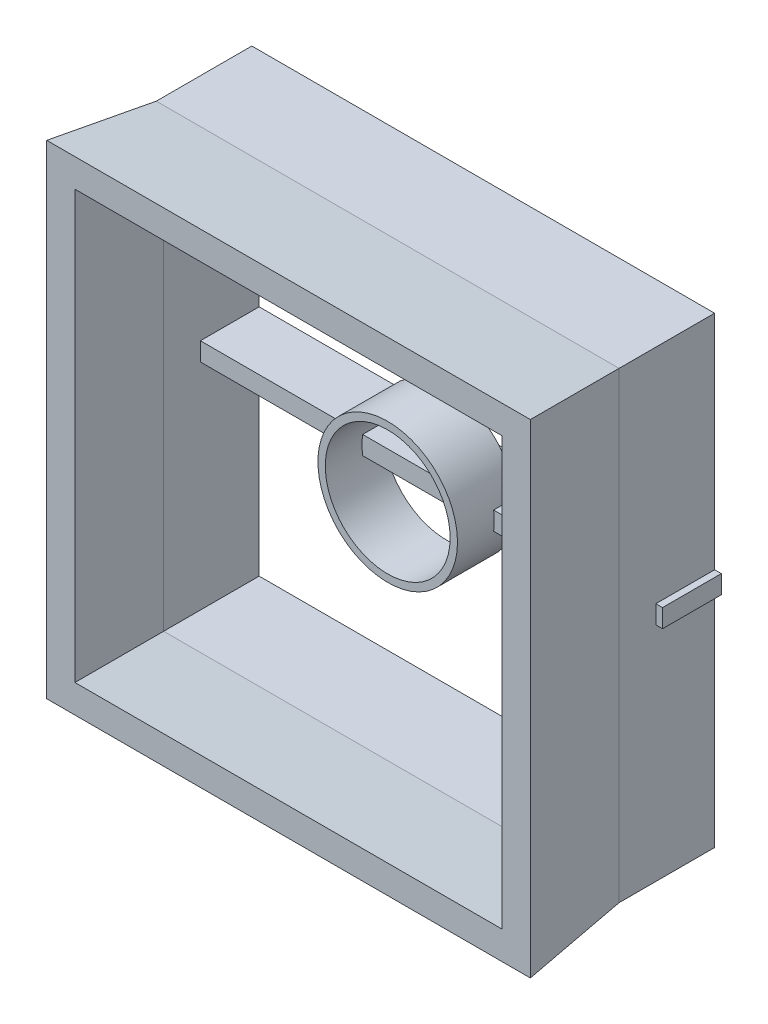
ISO-10303-21;
HEADER;
FILE_DESCRIPTION(('STEP AP214'),'2;1');
FILE_NAME('part.step','',(''),(''),'','','');
FILE_SCHEMA(('AUTOMOTIVE_DESIGN { 1 0 10303 214 1 1 1 1 }'));
ENDSEC;
DATA;
#1=APPLICATION_CONTEXT('core data for automotive mechanical design processes');
#2=APPLICATION_PROTOCOL_DEFINITION('international standard','automotive_design',2000,#1);
#3=PRODUCT_CONTEXT('',#1,'mechanical');
#4=PRODUCT('Part','Part','',(#3));
#5=PRODUCT_RELATED_PRODUCT_CATEGORY('part','',(#4));
#6=PRODUCT_DEFINITION_FORMATION('','',#4);
#7=PRODUCT_DEFINITION_CONTEXT('part definition',#1,'design');
#8=PRODUCT_DEFINITION('design','',#6,#7);
#9=PRODUCT_DEFINITION_SHAPE('','',#8);
#10=(LENGTH_UNIT() NAMED_UNIT(*) SI_UNIT(.MILLI.,.METRE.));
#11=(NAMED_UNIT(*) PLANE_ANGLE_UNIT() SI_UNIT($,.RADIAN.));
#12=(NAMED_UNIT(*) SI_UNIT($,.STERADIAN.) SOLID_ANGLE_UNIT());
#13=UNCERTAINTY_MEASURE_WITH_UNIT(LENGTH_MEASURE(1.E-05),#10,'distance_accuracy_value','');
#14=(GEOMETRIC_REPRESENTATION_CONTEXT(3) GLOBAL_UNCERTAINTY_ASSIGNED_CONTEXT((#13)) GLOBAL_UNIT_ASSIGNED_CONTEXT((#10,
#11,#12)) REPRESENTATION_CONTEXT('',''));
#15=CARTESIAN_POINT('',(0.,0.,0.));
#16=DIRECTION('',(0.,0.,1.));
#17=DIRECTION('',(1.,0.,0.));
#18=AXIS2_PLACEMENT_3D('',#15,#16,#17);
#19=CARTESIAN_POINT('',(0.,0.,-10.0000000000001));
#20=DIRECTION('',(0.,0.,1.));
#21=DIRECTION('',(1.,0.,0.));
#22=AXIS2_PLACEMENT_3D('',#19,#20,#21);
#23=PLANE('',#22);
#24=DIRECTION('',(-1.,0.,0.));
#25=VECTOR('',#24,1.);
#26=CARTESIAN_POINT('',(-64.1793889412606,2.5,-10.0000000000001));
#27=LINE('',#26,#25);
#28=CARTESIAN_POINT('',(-18.8348082018374,2.5,-10.0000000000001));
#29=VERTEX_POINT('',#28);
#30=CARTESIAN_POINT('',(-61.,2.5,-10.0000000000001));
#31=VERTEX_POINT('',#30);
#32=EDGE_CURVE('E373',#29,#31,#27,.T.);
#33=ORIENTED_EDGE('',*,*,#32,.T.);
#34=DIRECTION('',(0.,-1.,0.));
#35=VECTOR('',#34,1.);
#36=CARTESIAN_POINT('',(-61.,0.,-10.0000000000001));
#37=LINE('',#36,#35);
#38=CARTESIAN_POINT('',(-61.,-2.5,-10.0000000000001));
#39=VERTEX_POINT('',#38);
#40=EDGE_CURVE('E663',#31,#39,#37,.T.);
#41=ORIENTED_EDGE('',*,*,#40,.T.);
#42=DIRECTION('',(1.,0.,0.));
#43=VECTOR('',#42,1.);
#44=CARTESIAN_POINT('',(-64.1793889412606,-2.5,-10.0000000000001));
#45=LINE('',#44,#43);
#46=CARTESIAN_POINT('',(-18.8348082018374,-2.5,-10.0000000000001));
#47=VERTEX_POINT('',#46);
#48=EDGE_CURVE('E425',#39,#47,#45,.T.);
#49=ORIENTED_EDGE('',*,*,#48,.T.);
#50=CARTESIAN_POINT('',(0.,0.,-10.0000000000001));
#51=DIRECTION('',(0.,0.,1.));
#52=DIRECTION('',(1.,0.,0.));
#53=AXIS2_PLACEMENT_3D('',#50,#51,#52);
#54=CIRCLE('',#53,19.);
#55=EDGE_CURVE('E388',#47,#29,#54,.F.);
#56=ORIENTED_EDGE('',*,*,#55,.T.);
#57=EDGE_LOOP('',(#33,#41,#49,#56));
#58=FACE_BOUND('',#57,.T.);
#59=ADVANCED_FACE('F36',(#58),#23,.T.);
#60=CARTESIAN_POINT('',(64.8206110587394,2.5,-10.0000000000001));
#61=VERTEX_POINT('',#60);
#62=CARTESIAN_POINT('',(63.,2.5,-10.0000000000001));
#63=VERTEX_POINT('',#62);
#64=EDGE_CURVE('E358',#61,#63,#27,.T.);
#65=ORIENTED_EDGE('',*,*,#64,.T.);
#66=DIRECTION('',(0.,-1.,0.));
#67=VECTOR('',#66,1.);
#68=CARTESIAN_POINT('',(63.,0.,-10.0000000000001));
#69=LINE('',#68,#67);
#70=CARTESIAN_POINT('',(63.,-2.5,-10.0000000000001));
#71=VERTEX_POINT('',#70);
#72=EDGE_CURVE('E337',#63,#71,#69,.T.);
#73=ORIENTED_EDGE('',*,*,#72,.T.);
#74=CARTESIAN_POINT('',(64.8206110587394,-2.5,-10.0000000000001));
#75=VERTEX_POINT('',#74);
#76=EDGE_CURVE('E420',#71,#75,#45,.T.);
#77=ORIENTED_EDGE('',*,*,#76,.T.);
#78=DIRECTION('',(0.,1.,0.));
#79=VECTOR('',#78,1.);
#80=CARTESIAN_POINT('',(64.8206110587394,2.5,-10.0000000000001));
#81=LINE('',#80,#79);
#82=EDGE_CURVE('E345',#75,#61,#81,.T.);
#83=ORIENTED_EDGE('',*,*,#82,.T.);
#84=EDGE_LOOP('',(#65,#73,#77,#83));
#85=FACE_BOUND('',#84,.T.);
#86=ADVANCED_FACE('F558',(#85),#23,.T.);
#87=CARTESIAN_POINT('',(-64.1793889412606,2.5,-26.));
#88=DIRECTION('',(0.,1.,0.));
#89=DIRECTION('',(0.,0.,1.));
#90=AXIS2_PLACEMENT_3D('',#87,#88,#89);
#91=PLANE('',#90);
#92=DIRECTION('',(-1.,0.,0.));
#93=VECTOR('',#92,1.);
#94=CARTESIAN_POINT('',(-64.1793889412606,2.5,-26.));
#95=LINE('',#94,#93);
#96=CARTESIAN_POINT('',(64.8206110587394,2.5,-26.));
#97=VERTEX_POINT('',#96);
#98=CARTESIAN_POINT('',(63.,2.5,-26.));
#99=VERTEX_POINT('',#98);
#100=EDGE_CURVE('E62',#97,#99,#95,.T.);
#101=ORIENTED_EDGE('',*,*,#100,.T.);
#102=DIRECTION('',(0.,0.,1.));
#103=VECTOR('',#102,1.);
#104=CARTESIAN_POINT('',(63.,2.5,-26.));
#105=LINE('',#104,#103);
#106=EDGE_CURVE('E339',#99,#63,#105,.T.);
#107=ORIENTED_EDGE('',*,*,#106,.T.);
#108=ORIENTED_EDGE('',*,*,#64,.F.);
#109=DIRECTION('',(0.,0.,1.));
#110=VECTOR('',#109,1.);
#111=CARTESIAN_POINT('',(64.8206110587394,2.5,-26.));
#112=LINE('',#111,#110);
#113=EDGE_CURVE('E532',#97,#61,#112,.T.);
#114=ORIENTED_EDGE('',*,*,#113,.F.);
#115=EDGE_LOOP('',(#101,#107,#108,#114));
#116=FACE_BOUND('',#115,.T.);
#117=ADVANCED_FACE('F564',(#116),#91,.T.);
#118=DIRECTION('',(0.,0.,1.));
#119=VECTOR('',#118,1.);
#120=CARTESIAN_POINT('',(61.,2.5,-26.));
#121=LINE('',#120,#119);
#122=CARTESIAN_POINT('',(61.,2.5,-26.));
#123=VERTEX_POINT('',#122);
#124=CARTESIAN_POINT('',(61.,2.5,-10.0000000000001));
#125=VERTEX_POINT('',#124);
#126=EDGE_CURVE('E54',#123,#125,#121,.T.);
#127=ORIENTED_EDGE('',*,*,#126,.F.);
#128=CARTESIAN_POINT('',(-61.,2.49999999999999,-25.9999999999999));
#129=VERTEX_POINT('',#128);
#130=EDGE_CURVE('E255',#123,#129,#95,.T.);
#131=ORIENTED_EDGE('',*,*,#130,.T.);
#132=DIRECTION('',(0.,0.,1.));
#133=VECTOR('',#132,1.);
#134=CARTESIAN_POINT('',(-61.,2.5,-26.));
#135=LINE('',#134,#133);
#136=EDGE_CURVE('E291',#129,#31,#135,.T.);
#137=ORIENTED_EDGE('',*,*,#136,.T.);
#138=ORIENTED_EDGE('',*,*,#32,.F.);
#139=DIRECTION('',(0.,0.,1.));
#140=VECTOR('',#139,1.);
#141=CARTESIAN_POINT('',(-18.8348082018374,2.5,-16.));
#142=LINE('',#141,#140);
#143=CARTESIAN_POINT('',(-18.8348082018374,2.5,-16.));
#144=VERTEX_POINT('',#143);
#145=EDGE_CURVE('E384',#29,#144,#142,.F.);
#146=ORIENTED_EDGE('',*,*,#145,.T.);
#147=DIRECTION('',(-1.,0.,0.));
#148=VECTOR('',#147,1.);
#149=CARTESIAN_POINT('',(0.,2.5,-16.));
#150=LINE('',#149,#148);
#151=CARTESIAN_POINT('',(-16.8151717208002,2.5,-16.));
#152=VERTEX_POINT('',#151);
#153=EDGE_CURVE('E381',#152,#144,#150,.T.);
#154=ORIENTED_EDGE('',*,*,#153,.F.);
#155=DIRECTION('',(0.,0.,1.));
#156=VECTOR('',#155,1.);
#157=CARTESIAN_POINT('',(-16.8151717208002,2.5,-16.));
#158=LINE('',#157,#156);
#159=CARTESIAN_POINT('',(-16.8151717208002,2.5,-10.0000000000001));
#160=VERTEX_POINT('',#159);
#161=EDGE_CURVE('E409',#160,#152,#158,.F.);
#162=ORIENTED_EDGE('',*,*,#161,.F.);
#163=CARTESIAN_POINT('',(16.8151717208002,2.5,-10.0000000000001));
#164=VERTEX_POINT('',#163);
#165=EDGE_CURVE('E359',#164,#160,#27,.T.);
#166=ORIENTED_EDGE('',*,*,#165,.F.);
#167=DIRECTION('',(0.,0.,1.));
#168=VECTOR('',#167,1.);
#169=CARTESIAN_POINT('',(16.8151717208002,2.5,-16.));
#170=LINE('',#169,#168);
#171=CARTESIAN_POINT('',(16.8151717208002,2.5,-16.));
#172=VERTEX_POINT('',#171);
#173=EDGE_CURVE('E416',#172,#164,#170,.T.);
#174=ORIENTED_EDGE('',*,*,#173,.F.);
#175=CARTESIAN_POINT('',(18.8348082018374,2.5,-16.));
#176=VERTEX_POINT('',#175);
#177=EDGE_CURVE('E376',#176,#172,#150,.T.);
#178=ORIENTED_EDGE('',*,*,#177,.F.);
#179=DIRECTION('',(0.,0.,1.));
#180=VECTOR('',#179,1.);
#181=CARTESIAN_POINT('',(18.8348082018374,2.5,-16.));
#182=LINE('',#181,#180);
#183=CARTESIAN_POINT('',(18.8348082018374,2.5,-10.0000000000001));
#184=VERTEX_POINT('',#183);
#185=EDGE_CURVE('E379',#176,#184,#182,.T.);
#186=ORIENTED_EDGE('',*,*,#185,.T.);
#187=EDGE_CURVE('E355',#125,#184,#27,.T.);
#188=ORIENTED_EDGE('',*,*,#187,.F.);
#189=EDGE_LOOP('',(#127,#131,#137,#138,#146,#154,#162,#166,#174,#178,#186,#188));
#190=FACE_BOUND('',#189,.T.);
#191=ADVANCED_FACE('F566',(#190),#91,.T.);
#192=CARTESIAN_POINT('',(-64.1793889412606,-2.5,-26.));
#193=DIRECTION('',(0.,-1.,0.));
#194=DIRECTION('',(0.,0.,-1.));
#195=AXIS2_PLACEMENT_3D('',#192,#193,#194);
#196=PLANE('',#195);
#197=ORIENTED_EDGE('',*,*,#76,.F.);
#198=DIRECTION('',(0.,0.,-1.));
#199=VECTOR('',#198,1.);
#200=CARTESIAN_POINT('',(63.,-2.5,-26.));
#201=LINE('',#200,#199);
#202=CARTESIAN_POINT('',(63.,-2.5,-26.));
#203=VERTEX_POINT('',#202);
#204=EDGE_CURVE('E12',#71,#203,#201,.T.);
#205=ORIENTED_EDGE('',*,*,#204,.T.);
#206=DIRECTION('',(1.,0.,0.));
#207=VECTOR('',#206,1.);
#208=CARTESIAN_POINT('',(-64.1793889412606,-2.5,-26.));
#209=LINE('',#208,#207);
#210=CARTESIAN_POINT('',(64.8206110587394,-2.5,-26.));
#211=VERTEX_POINT('',#210);
#212=EDGE_CURVE('E488',#203,#211,#209,.T.);
#213=ORIENTED_EDGE('',*,*,#212,.T.);
#214=DIRECTION('',(0.,0.,1.));
#215=VECTOR('',#214,1.);
#216=CARTESIAN_POINT('',(64.8206110587394,-2.5,-26.));
#217=LINE('',#216,#215);
#218=EDGE_CURVE('E431',#211,#75,#217,.T.);
#219=ORIENTED_EDGE('',*,*,#218,.T.);
#220=EDGE_LOOP('',(#197,#205,#213,#219));
#221=FACE_BOUND('',#220,.T.);
#222=ADVANCED_FACE('F553',(#221),#196,.T.);
#223=DIRECTION('',(0.,0.,-1.));
#224=VECTOR('',#223,1.);
#225=CARTESIAN_POINT('',(61.,-2.5,-26.));
#226=LINE('',#225,#224);
#227=CARTESIAN_POINT('',(61.,-2.5,-10.0000000000001));
#228=VERTEX_POINT('',#227);
#229=CARTESIAN_POINT('',(61.,-2.5,-25.9999999999999));
#230=VERTEX_POINT('',#229);
#231=EDGE_CURVE('E507',#228,#230,#226,.T.);
#232=ORIENTED_EDGE('',*,*,#231,.F.);
#233=CARTESIAN_POINT('',(18.8348082018374,-2.5,-10.0000000000001));
#234=VERTEX_POINT('',#233);
#235=EDGE_CURVE('E423',#234,#228,#45,.T.);
#236=ORIENTED_EDGE('',*,*,#235,.F.);
#237=DIRECTION('',(0.,0.,1.));
#238=VECTOR('',#237,1.);
#239=CARTESIAN_POINT('',(18.8348082018374,-2.5,-16.));
#240=LINE('',#239,#238);
#241=CARTESIAN_POINT('',(18.8348082018374,-2.5,-16.));
#242=VERTEX_POINT('',#241);
#243=EDGE_CURVE('E380',#234,#242,#240,.F.);
#244=ORIENTED_EDGE('',*,*,#243,.T.);
#245=DIRECTION('',(1.,0.,0.));
#246=VECTOR('',#245,1.);
#247=CARTESIAN_POINT('',(0.,-2.5,-16.));
#248=LINE('',#247,#246);
#249=CARTESIAN_POINT('',(16.8151717208002,-2.5,-16.));
#250=VERTEX_POINT('',#249);
#251=EDGE_CURVE('E447',#250,#242,#248,.T.);
#252=ORIENTED_EDGE('',*,*,#251,.F.);
#253=DIRECTION('',(0.,0.,1.));
#254=VECTOR('',#253,1.);
#255=CARTESIAN_POINT('',(16.8151717208002,-2.5,-16.));
#256=LINE('',#255,#254);
#257=CARTESIAN_POINT('',(16.8151717208002,-2.5,-10.0000000000001));
#258=VERTEX_POINT('',#257);
#259=EDGE_CURVE('E413',#258,#250,#256,.F.);
#260=ORIENTED_EDGE('',*,*,#259,.F.);
#261=CARTESIAN_POINT('',(-16.8151717208002,-2.5,-10.0000000000001));
#262=VERTEX_POINT('',#261);
#263=EDGE_CURVE('E438',#262,#258,#45,.T.);
#264=ORIENTED_EDGE('',*,*,#263,.F.);
#265=DIRECTION('',(0.,0.,1.));
#266=VECTOR('',#265,1.);
#267=CARTESIAN_POINT('',(-16.8151717208002,-2.5,-16.));
#268=LINE('',#267,#266);
#269=CARTESIAN_POINT('',(-16.8151717208002,-2.5,-16.));
#270=VERTEX_POINT('',#269);
#271=EDGE_CURVE('E400',#270,#262,#268,.T.);
#272=ORIENTED_EDGE('',*,*,#271,.F.);
#273=CARTESIAN_POINT('',(-18.8348082018374,-2.5,-16.));
#274=VERTEX_POINT('',#273);
#275=EDGE_CURVE('E443',#274,#270,#248,.T.);
#276=ORIENTED_EDGE('',*,*,#275,.F.);
#277=DIRECTION('',(0.,0.,1.));
#278=VECTOR('',#277,1.);
#279=CARTESIAN_POINT('',(-18.8348082018374,-2.5,-16.));
#280=LINE('',#279,#278);
#281=EDGE_CURVE('E446',#274,#47,#280,.T.);
#282=ORIENTED_EDGE('',*,*,#281,.T.);
#283=ORIENTED_EDGE('',*,*,#48,.F.);
#284=DIRECTION('',(0.,0.,-1.));
#285=VECTOR('',#284,1.);
#286=CARTESIAN_POINT('',(-61.,-2.5,-26.));
#287=LINE('',#286,#285);
#288=CARTESIAN_POINT('',(-61.,-2.5,-26.));
#289=VERTEX_POINT('',#288);
#290=EDGE_CURVE('E419',#39,#289,#287,.T.);
#291=ORIENTED_EDGE('',*,*,#290,.T.);
#292=EDGE_CURVE('E494',#289,#230,#209,.T.);
#293=ORIENTED_EDGE('',*,*,#292,.T.);
#294=EDGE_LOOP('',(#232,#236,#244,#252,#260,#264,#272,#276,#282,#283,#291,#293));
#295=FACE_BOUND('',#294,.T.);
#296=ADVANCED_FACE('F467',(#295),#196,.T.);
#297=CARTESIAN_POINT('',(0.,0.,-16.));
#298=DIRECTION('',(0.,0.,1.));
#299=DIRECTION('',(1.,0.,0.));
#300=AXIS2_PLACEMENT_3D('',#297,#298,#299);
#301=PLANE('',#300);
#302=CARTESIAN_POINT('',(0.,0.,-16.));
#303=DIRECTION('',(0.,0.,1.));
#304=DIRECTION('',(1.,0.,0.));
#305=AXIS2_PLACEMENT_3D('',#302,#303,#304);
#306=CIRCLE('',#305,19.);
#307=EDGE_CURVE('E397',#176,#144,#306,.T.);
#308=ORIENTED_EDGE('',*,*,#307,.F.);
#309=ORIENTED_EDGE('',*,*,#177,.T.);
#310=CARTESIAN_POINT('',(0.,0.,-16.));
#311=DIRECTION('',(0.,0.,1.));
#312=DIRECTION('',(1.,0.,0.));
#313=AXIS2_PLACEMENT_3D('',#310,#311,#312);
#314=CIRCLE('',#313,17.);
#315=EDGE_CURVE('E389',#172,#152,#314,.T.);
#316=ORIENTED_EDGE('',*,*,#315,.T.);
#317=ORIENTED_EDGE('',*,*,#153,.T.);
#318=EDGE_LOOP('',(#308,#309,#316,#317));
#319=FACE_BOUND('',#318,.T.);
#320=ADVANCED_FACE('F850',(#319),#301,.F.);
#321=CARTESIAN_POINT('',(0.,0.,-16.));
#322=DIRECTION('',(0.,0.,1.));
#323=DIRECTION('',(1.,0.,0.));
#324=AXIS2_PLACEMENT_3D('',#321,#322,#323);
#325=CYLINDRICAL_SURFACE('',#324,19.);
#326=ORIENTED_EDGE('',*,*,#185,.F.);
#327=ORIENTED_EDGE('',*,*,#307,.T.);
#328=ORIENTED_EDGE('',*,*,#145,.F.);
#329=ORIENTED_EDGE('',*,*,#55,.F.);
#330=ORIENTED_EDGE('',*,*,#281,.F.);
#331=EDGE_CURVE('E401',#274,#242,#306,.T.);
#332=ORIENTED_EDGE('',*,*,#331,.T.);
#333=ORIENTED_EDGE('',*,*,#243,.F.);
#334=EDGE_CURVE('E386',#184,#234,#54,.F.);
#335=ORIENTED_EDGE('',*,*,#334,.F.);
#336=EDGE_LOOP('',(#326,#327,#328,#329,#330,#332,#333,#335));
#337=FACE_BOUND('',#336,.T.);
#338=CARTESIAN_POINT('',(0.,0.,0.));
#339=DIRECTION('',(0.,0.,1.));
#340=DIRECTION('',(1.,0.,0.));
#341=AXIS2_PLACEMENT_3D('',#338,#339,#340);
#342=CIRCLE('',#341,19.);
#343=CARTESIAN_POINT('',(19.,0.,0.));
#344=VERTEX_POINT('',#343);
#345=EDGE_CURVE('E392',#344,#344,#342,.T.);
#346=ORIENTED_EDGE('',*,*,#345,.F.);
#347=EDGE_LOOP('',(#346));
#348=FACE_BOUND('',#347,.T.);
#349=ADVANCED_FACE('F38',(#337,#348),#325,.T.);
#350=ORIENTED_EDGE('',*,*,#331,.F.);
#351=ORIENTED_EDGE('',*,*,#275,.T.);
#352=EDGE_CURVE('E393',#270,#250,#314,.T.);
#353=ORIENTED_EDGE('',*,*,#352,.T.);
#354=ORIENTED_EDGE('',*,*,#251,.T.);
#355=EDGE_LOOP('',(#350,#351,#353,#354));
#356=FACE_BOUND('',#355,.T.);
#357=ADVANCED_FACE('F457',(#356),#301,.F.);
#358=CARTESIAN_POINT('',(0.,0.,0.));
#359=DIRECTION('',(0.,0.,1.));
#360=DIRECTION('',(1.,0.,0.));
#361=AXIS2_PLACEMENT_3D('',#358,#359,#360);
#362=PLANE('',#361);
#363=CARTESIAN_POINT('',(0.,0.,0.));
#364=DIRECTION('',(0.,0.,1.));
#365=DIRECTION('',(1.,0.,0.));
#366=AXIS2_PLACEMENT_3D('',#363,#364,#365);
#367=CIRCLE('',#366,17.);
#368=CARTESIAN_POINT('',(17.,0.,0.));
#369=VERTEX_POINT('',#368);
#370=EDGE_CURVE('E394',#369,#369,#367,.T.);
#371=ORIENTED_EDGE('',*,*,#370,.F.);
#372=EDGE_LOOP('',(#371));
#373=FACE_BOUND('',#372,.T.);
#374=ORIENTED_EDGE('',*,*,#345,.T.);
#375=EDGE_LOOP('',(#374));
#376=FACE_BOUND('',#375,.T.);
#377=ADVANCED_FACE('F977',(#373,#376),#362,.T.);
#378=CARTESIAN_POINT('',(0.,0.,-16.));
#379=DIRECTION('',(0.,0.,1.));
#380=DIRECTION('',(1.,0.,0.));
#381=AXIS2_PLACEMENT_3D('',#378,#379,#380);
#382=CYLINDRICAL_SURFACE('',#381,17.);
#383=ORIENTED_EDGE('',*,*,#315,.F.);
#384=ORIENTED_EDGE('',*,*,#173,.T.);
#385=CARTESIAN_POINT('',(0.,0.,-10.0000000000001));
#386=DIRECTION('',(0.,0.,1.));
#387=DIRECTION('',(1.,0.,0.));
#388=AXIS2_PLACEMENT_3D('',#385,#386,#387);
#389=CIRCLE('',#388,17.);
#390=EDGE_CURVE('E410',#164,#258,#389,.F.);
#391=ORIENTED_EDGE('',*,*,#390,.T.);
#392=ORIENTED_EDGE('',*,*,#259,.T.);
#393=ORIENTED_EDGE('',*,*,#352,.F.);
#394=ORIENTED_EDGE('',*,*,#271,.T.);
#395=EDGE_CURVE('E406',#262,#160,#389,.F.);
#396=ORIENTED_EDGE('',*,*,#395,.T.);
#397=ORIENTED_EDGE('',*,*,#161,.T.);
#398=EDGE_LOOP('',(#383,#384,#391,#392,#393,#394,#396,#397));
#399=FACE_BOUND('',#398,.T.);
#400=ORIENTED_EDGE('',*,*,#370,.T.);
#401=EDGE_LOOP('',(#400));
#402=FACE_BOUND('',#401,.T.);
#403=ADVANCED_FACE('F471',(#399,#402),#382,.F.);
#404=ORIENTED_EDGE('',*,*,#395,.F.);
#405=ORIENTED_EDGE('',*,*,#263,.T.);
#406=ORIENTED_EDGE('',*,*,#390,.F.);
#407=ORIENTED_EDGE('',*,*,#165,.T.);
#408=EDGE_LOOP('',(#404,#405,#406,#407));
#409=FACE_BOUND('',#408,.T.);
#410=ADVANCED_FACE('F477',(#409),#23,.T.);
#411=DIRECTION('',(0.,-1.,0.));
#412=VECTOR('',#411,1.);
#413=CARTESIAN_POINT('',(-63.,0.,-10.0000000000001));
#414=LINE('',#413,#412);
#415=CARTESIAN_POINT('',(-63.,2.5,-10.0000000000001));
#416=VERTEX_POINT('',#415);
#417=CARTESIAN_POINT('',(-63.,-2.5,-10.0000000000001));
#418=VERTEX_POINT('',#417);
#419=EDGE_CURVE('E297',#416,#418,#414,.T.);
#420=ORIENTED_EDGE('',*,*,#419,.F.);
#421=CARTESIAN_POINT('',(-64.1793889412606,2.5,-10.0000000000001));
#422=VERTEX_POINT('',#421);
#423=EDGE_CURVE('E341',#416,#422,#27,.T.);
#424=ORIENTED_EDGE('',*,*,#423,.T.);
#425=DIRECTION('',(0.,-1.,0.));
#426=VECTOR('',#425,1.);
#427=CARTESIAN_POINT('',(-64.1793889412606,2.5,-10.0000000000001));
#428=LINE('',#427,#426);
#429=CARTESIAN_POINT('',(-64.1793889412606,-2.5,-10.0000000000001));
#430=VERTEX_POINT('',#429);
#431=EDGE_CURVE('E364',#422,#430,#428,.T.);
#432=ORIENTED_EDGE('',*,*,#431,.T.);
#433=EDGE_CURVE('E430',#430,#418,#45,.T.);
#434=ORIENTED_EDGE('',*,*,#433,.T.);
#435=EDGE_LOOP('',(#420,#424,#432,#434));
#436=FACE_BOUND('',#435,.T.);
#437=ADVANCED_FACE('F527',(#436),#23,.T.);
#438=DIRECTION('',(0.,-1.,0.));
#439=VECTOR('',#438,1.);
#440=CARTESIAN_POINT('',(61.,0.,-10.0000000000001));
#441=LINE('',#440,#439);
#442=EDGE_CURVE('E293',#125,#228,#441,.T.);
#443=ORIENTED_EDGE('',*,*,#442,.F.);
#444=ORIENTED_EDGE('',*,*,#187,.T.);
#445=ORIENTED_EDGE('',*,*,#334,.T.);
#446=ORIENTED_EDGE('',*,*,#235,.T.);
#447=EDGE_LOOP('',(#443,#444,#445,#446));
#448=FACE_BOUND('',#447,.T.);
#449=ADVANCED_FACE('F577',(#448),#23,.T.);
#450=CARTESIAN_POINT('',(0.,0.,-26.));
#451=DIRECTION('',(0.,0.,1.));
#452=DIRECTION('',(1.,0.,0.));
#453=AXIS2_PLACEMENT_3D('',#450,#451,#452);
#454=PLANE('',#453);
#455=CARTESIAN_POINT('',(-63.,2.5,-25.9999999999999));
#456=VERTEX_POINT('',#455);
#457=CARTESIAN_POINT('',(-64.1793889412606,2.5,-26.));
#458=VERTEX_POINT('',#457);
#459=EDGE_CURVE('E40',#456,#458,#95,.T.);
#460=ORIENTED_EDGE('',*,*,#459,.F.);
#461=DIRECTION('',(0.,1.,0.));
#462=VECTOR('',#461,1.);
#463=CARTESIAN_POINT('',(-63.,-63.,-25.9999999999999));
#464=LINE('',#463,#462);
#465=CARTESIAN_POINT('',(-63.,63.,-25.9999999999999));
#466=VERTEX_POINT('',#465);
#467=EDGE_CURVE('E298',#456,#466,#464,.T.);
#468=ORIENTED_EDGE('',*,*,#467,.T.);
#469=DIRECTION('',(1.,0.,0.));
#470=VECTOR('',#469,1.);
#471=CARTESIAN_POINT('',(-63.,63.,-25.9999999999999));
#472=LINE('',#471,#470);
#473=CARTESIAN_POINT('',(63.,63.,-25.9999999999999));
#474=VERTEX_POINT('',#473);
#475=EDGE_CURVE('E315',#466,#474,#472,.T.);
#476=ORIENTED_EDGE('',*,*,#475,.T.);
#477=DIRECTION('',(0.,1.,0.));
#478=VECTOR('',#477,1.);
#479=CARTESIAN_POINT('',(63.,-63.,-25.9999999999999));
#480=LINE('',#479,#478);
#481=EDGE_CURVE('E328',#99,#474,#480,.T.);
#482=ORIENTED_EDGE('',*,*,#481,.F.);
#483=ORIENTED_EDGE('',*,*,#100,.F.);
#484=DIRECTION('',(0.,1.,0.));
#485=VECTOR('',#484,1.);
#486=CARTESIAN_POINT('',(64.8206110587394,2.5,-26.));
#487=LINE('',#486,#485);
#488=EDGE_CURVE('E424',#211,#97,#487,.T.);
#489=ORIENTED_EDGE('',*,*,#488,.F.);
#490=ORIENTED_EDGE('',*,*,#212,.F.);
#491=CARTESIAN_POINT('',(63.,-63.,-25.9999999999999));
#492=VERTEX_POINT('',#491);
#493=EDGE_CURVE('E323',#492,#203,#480,.T.);
#494=ORIENTED_EDGE('',*,*,#493,.F.);
#495=DIRECTION('',(1.,0.,0.));
#496=VECTOR('',#495,1.);
#497=CARTESIAN_POINT('',(-63.,-63.,-25.9999999999999));
#498=LINE('',#497,#496);
#499=CARTESIAN_POINT('',(-63.,-63.,-25.9999999999999));
#500=VERTEX_POINT('',#499);
#501=EDGE_CURVE('E308',#500,#492,#498,.T.);
#502=ORIENTED_EDGE('',*,*,#501,.F.);
#503=CARTESIAN_POINT('',(-63.,-2.5,-25.9999999999999));
#504=VERTEX_POINT('',#503);
#505=EDGE_CURVE('E301',#500,#504,#464,.T.);
#506=ORIENTED_EDGE('',*,*,#505,.T.);
#507=CARTESIAN_POINT('',(-64.1793889412606,-2.5,-26.));
#508=VERTEX_POINT('',#507);
#509=EDGE_CURVE('E500',#508,#504,#209,.T.);
#510=ORIENTED_EDGE('',*,*,#509,.F.);
#511=DIRECTION('',(0.,-1.,0.));
#512=VECTOR('',#511,1.);
#513=CARTESIAN_POINT('',(-64.1793889412606,2.5,-26.));
#514=LINE('',#513,#512);
#515=EDGE_CURVE('E350',#458,#508,#514,.T.);
#516=ORIENTED_EDGE('',*,*,#515,.F.);
#517=EDGE_LOOP('',(#460,#468,#476,#482,#483,#489,#490,#494,#502,#506,#510,#516));
#518=FACE_BOUND('',#517,.T.);
#519=DIRECTION('',(0.,1.,0.));
#520=VECTOR('',#519,1.);
#521=CARTESIAN_POINT('',(61.,-61.,-25.9999999999999));
#522=LINE('',#521,#520);
#523=CARTESIAN_POINT('',(61.,-61.,-25.9999999999999));
#524=VERTEX_POINT('',#523);
#525=EDGE_CURVE('E257',#524,#230,#522,.T.);
#526=ORIENTED_EDGE('',*,*,#525,.T.);
#527=ORIENTED_EDGE('',*,*,#292,.F.);
#528=DIRECTION('',(0.,1.,0.));
#529=VECTOR('',#528,1.);
#530=CARTESIAN_POINT('',(-61.,-61.,-25.9999999999999));
#531=LINE('',#530,#529);
#532=CARTESIAN_POINT('',(-61.,-61.,-25.9999999999999));
#533=VERTEX_POINT('',#532);
#534=EDGE_CURVE('E312',#533,#289,#531,.T.);
#535=ORIENTED_EDGE('',*,*,#534,.F.);
#536=DIRECTION('',(1.,0.,0.));
#537=VECTOR('',#536,1.);
#538=CARTESIAN_POINT('',(-61.,-61.,-25.9999999999999));
#539=LINE('',#538,#537);
#540=EDGE_CURVE('E713',#533,#524,#539,.T.);
#541=ORIENTED_EDGE('',*,*,#540,.T.);
#542=EDGE_LOOP('',(#526,#527,#535,#541));
#543=FACE_BOUND('',#542,.T.);
#544=ORIENTED_EDGE('',*,*,#130,.F.);
#545=CARTESIAN_POINT('',(61.,61.,-25.9999999999999));
#546=VERTEX_POINT('',#545);
#547=EDGE_CURVE('E249',#123,#546,#522,.T.);
#548=ORIENTED_EDGE('',*,*,#547,.T.);
#549=DIRECTION('',(1.,0.,0.));
#550=VECTOR('',#549,1.);
#551=CARTESIAN_POINT('',(-61.,61.,-25.9999999999999));
#552=LINE('',#551,#550);
#553=CARTESIAN_POINT('',(-61.,61.,-25.9999999999999));
#554=VERTEX_POINT('',#553);
#555=EDGE_CURVE('E254',#554,#546,#552,.T.);
#556=ORIENTED_EDGE('',*,*,#555,.F.);
#557=EDGE_CURVE('E273',#129,#554,#531,.T.);
#558=ORIENTED_EDGE('',*,*,#557,.F.);
#559=EDGE_LOOP('',(#544,#548,#556,#558));
#560=FACE_BOUND('',#559,.T.);
#561=ADVANCED_FACE('F251',(#518,#543,#560),#454,.F.);
#562=DIRECTION('',(0.,0.,1.));
#563=VECTOR('',#562,1.);
#564=CARTESIAN_POINT('',(-63.,2.5,-26.));
#565=LINE('',#564,#563);
#566=EDGE_CURVE('E336',#456,#416,#565,.T.);
#567=ORIENTED_EDGE('',*,*,#566,.F.);
#568=ORIENTED_EDGE('',*,*,#459,.T.);
#569=DIRECTION('',(0.,0.,1.));
#570=VECTOR('',#569,1.);
#571=CARTESIAN_POINT('',(-64.1793889412606,2.5,-26.));
#572=LINE('',#571,#570);
#573=EDGE_CURVE('E342',#458,#422,#572,.T.);
#574=ORIENTED_EDGE('',*,*,#573,.T.);
#575=ORIENTED_EDGE('',*,*,#423,.F.);
#576=EDGE_LOOP('',(#567,#568,#574,#575));
#577=FACE_BOUND('',#576,.T.);
#578=ADVANCED_FACE('F531',(#577),#91,.T.);
#579=CARTESIAN_POINT('',(64.8206110587394,2.5,-26.));
#580=DIRECTION('',(1.,0.,0.));
#581=DIRECTION('',(0.,0.,-1.));
#582=AXIS2_PLACEMENT_3D('',#579,#580,#581);
#583=PLANE('',#582);
#584=ORIENTED_EDGE('',*,*,#82,.F.);
#585=ORIENTED_EDGE('',*,*,#218,.F.);
#586=ORIENTED_EDGE('',*,*,#488,.T.);
#587=ORIENTED_EDGE('',*,*,#113,.T.);
#588=EDGE_LOOP('',(#584,#585,#586,#587));
#589=FACE_BOUND('',#588,.T.);
#590=ADVANCED_FACE('F556',(#589),#583,.T.);
#591=DIRECTION('',(0.,0.,-1.));
#592=VECTOR('',#591,1.);
#593=CARTESIAN_POINT('',(-63.,-2.5,-26.));
#594=LINE('',#593,#592);
#595=EDGE_CURVE('E46',#418,#504,#594,.T.);
#596=ORIENTED_EDGE('',*,*,#595,.F.);
#597=ORIENTED_EDGE('',*,*,#433,.F.);
#598=DIRECTION('',(0.,0.,1.));
#599=VECTOR('',#598,1.);
#600=CARTESIAN_POINT('',(-64.1793889412606,-2.5,-26.));
#601=LINE('',#600,#599);
#602=EDGE_CURVE('E483',#508,#430,#601,.T.);
#603=ORIENTED_EDGE('',*,*,#602,.F.);
#604=ORIENTED_EDGE('',*,*,#509,.T.);
#605=EDGE_LOOP('',(#596,#597,#603,#604));
#606=FACE_BOUND('',#605,.T.);
#607=ADVANCED_FACE('F524',(#606),#196,.T.);
#608=CARTESIAN_POINT('',(-64.1793889412606,2.5,-26.));
#609=DIRECTION('',(-1.,0.,0.));
#610=DIRECTION('',(0.,0.,1.));
#611=AXIS2_PLACEMENT_3D('',#608,#609,#610);
#612=PLANE('',#611);
#613=ORIENTED_EDGE('',*,*,#431,.F.);
#614=ORIENTED_EDGE('',*,*,#573,.F.);
#615=ORIENTED_EDGE('',*,*,#515,.T.);
#616=ORIENTED_EDGE('',*,*,#602,.T.);
#617=EDGE_LOOP('',(#613,#614,#615,#616));
#618=FACE_BOUND('',#617,.T.);
#619=ADVANCED_FACE('F526',(#618),#612,.T.);
#620=CARTESIAN_POINT('',(0.,0.,26.9999999999999));
#621=DIRECTION('',(0.,0.,-1.));
#622=DIRECTION('',(-1.,0.,0.));
#623=AXIS2_PLACEMENT_3D('',#620,#621,#622);
#624=PLANE('',#623);
#625=DIRECTION('',(0.,-1.,0.));
#626=VECTOR('',#625,1.);
#627=CARTESIAN_POINT('',(58.1621856478267,-61.,26.9999999999999));
#628=LINE('',#627,#626);
#629=CARTESIAN_POINT('',(58.1621856478267,-58.1621856478267,26.9999999999999));
#630=VERTEX_POINT('',#629);
#631=CARTESIAN_POINT('',(58.1621856478267,58.1621856478267,26.9999999999999));
#632=VERTEX_POINT('',#631);
#633=EDGE_CURVE('E699',#630,#632,#628,.F.);
#634=ORIENTED_EDGE('',*,*,#633,.F.);
#635=DIRECTION('',(-1.,0.,0.));
#636=VECTOR('',#635,1.);
#637=CARTESIAN_POINT('',(-61.,-58.1621856478267,26.9999999999999));
#638=LINE('',#637,#636);
#639=CARTESIAN_POINT('',(-58.1621856478267,-58.1621856478267,26.9999999999999));
#640=VERTEX_POINT('',#639);
#641=EDGE_CURVE('E523',#640,#630,#638,.F.);
#642=ORIENTED_EDGE('',*,*,#641,.F.);
#643=DIRECTION('',(0.,1.,0.));
#644=VECTOR('',#643,1.);
#645=CARTESIAN_POINT('',(-58.1621856478267,-61.,26.9999999999999));
#646=LINE('',#645,#644);
#647=CARTESIAN_POINT('',(-58.1621856478267,58.1621856478267,26.9999999999999));
#648=VERTEX_POINT('',#647);
#649=EDGE_CURVE('E680',#640,#648,#646,.T.);
#650=ORIENTED_EDGE('',*,*,#649,.T.);
#651=DIRECTION('',(1.,0.,0.));
#652=VECTOR('',#651,1.);
#653=CARTESIAN_POINT('',(-61.,58.1621856478267,26.9999999999999));
#654=LINE('',#653,#652);
#655=EDGE_CURVE('E674',#648,#632,#654,.T.);
#656=ORIENTED_EDGE('',*,*,#655,.T.);
#657=EDGE_LOOP('',(#634,#642,#650,#656));
#658=FACE_BOUND('',#657,.T.);
#659=DIRECTION('',(1.,0.,0.));
#660=VECTOR('',#659,1.);
#661=CARTESIAN_POINT('',(-63.,-65.8378143521733,26.9999999999999));
#662=LINE('',#661,#660);
#663=CARTESIAN_POINT('',(-65.8378143521733,-65.8378143521733,26.9999999999999));
#664=VERTEX_POINT('',#663);
#665=CARTESIAN_POINT('',(65.8378143521733,-65.8378143521733,26.9999999999999));
#666=VERTEX_POINT('',#665);
#667=EDGE_CURVE('E633',#664,#666,#662,.T.);
#668=ORIENTED_EDGE('',*,*,#667,.T.);
#669=DIRECTION('',(0.,1.,0.));
#670=VECTOR('',#669,1.);
#671=CARTESIAN_POINT('',(65.8378143521733,-63.,26.9999999999999));
#672=LINE('',#671,#670);
#673=CARTESIAN_POINT('',(65.8378143521733,65.8378143521733,26.9999999999999));
#674=VERTEX_POINT('',#673);
#675=EDGE_CURVE('E618',#666,#674,#672,.T.);
#676=ORIENTED_EDGE('',*,*,#675,.T.);
#677=DIRECTION('',(-1.,0.,0.));
#678=VECTOR('',#677,1.);
#679=CARTESIAN_POINT('',(-63.,65.8378143521733,26.9999999999999));
#680=LINE('',#679,#678);
#681=CARTESIAN_POINT('',(-65.8378143521733,65.8378143521733,26.9999999999999));
#682=VERTEX_POINT('',#681);
#683=EDGE_CURVE('E635',#682,#674,#680,.F.);
#684=ORIENTED_EDGE('',*,*,#683,.F.);
#685=DIRECTION('',(0.,-1.,0.));
#686=VECTOR('',#685,1.);
#687=CARTESIAN_POINT('',(-65.8378143521733,-63.,26.9999999999999));
#688=LINE('',#687,#686);
#689=EDGE_CURVE('E638',#664,#682,#688,.F.);
#690=ORIENTED_EDGE('',*,*,#689,.F.);
#691=EDGE_LOOP('',(#668,#676,#684,#690));
#692=FACE_BOUND('',#691,.T.);
#693=ADVANCED_FACE('F613',(#658,#692),#624,.F.);
#694=CARTESIAN_POINT('',(-63.,-63.,0.));
#695=DIRECTION('',(0.,-0.994521895368273,-0.104528463267654));
#696=DIRECTION('',(0.,0.104528463267654,-0.994521895368273));
#697=AXIS2_PLACEMENT_3D('',#694,#695,#696);
#698=PLANE('',#697);
#699=ORIENTED_EDGE('',*,*,#667,.F.);
#700=DIRECTION('',(0.103962051184499,0.103962051184499,-0.989132844377854));
#701=VECTOR('',#700,1.);
#702=CARTESIAN_POINT('',(-63.,-63.,0.));
#703=LINE('',#702,#701);
#704=CARTESIAN_POINT('',(-63.,-63.,0.));
#705=VERTEX_POINT('',#704);
#706=EDGE_CURVE('E655',#705,#664,#703,.F.);
#707=ORIENTED_EDGE('',*,*,#706,.F.);
#708=DIRECTION('',(1.,0.,0.));
#709=VECTOR('',#708,1.);
#710=CARTESIAN_POINT('',(-63.,-63.,0.));
#711=LINE('',#710,#709);
#712=CARTESIAN_POINT('',(63.,-63.,0.));
#713=VERTEX_POINT('',#712);
#714=EDGE_CURVE('E629',#705,#713,#711,.T.);
#715=ORIENTED_EDGE('',*,*,#714,.T.);
#716=DIRECTION('',(0.103962051184499,-0.103962051184499,0.989132844377854));
#717=VECTOR('',#716,1.);
#718=CARTESIAN_POINT('',(61.6381783811025,-61.6381783811025,-12.9568672038304));
#719=LINE('',#718,#717);
#720=EDGE_CURVE('E621',#713,#666,#719,.T.);
#721=ORIENTED_EDGE('',*,*,#720,.T.);
#722=EDGE_LOOP('',(#699,#707,#715,#721));
#723=FACE_BOUND('',#722,.T.);
#724=ADVANCED_FACE('F608',(#723),#698,.T.);
#725=CARTESIAN_POINT('',(63.,-63.,0.));
#726=DIRECTION('',(0.994521895368273,0.,-0.104528463267654));
#727=DIRECTION('',(-0.104528463267654,0.,-0.994521895368273));
#728=AXIS2_PLACEMENT_3D('',#725,#726,#727);
#729=PLANE('',#728);
#730=ORIENTED_EDGE('',*,*,#675,.F.);
#731=ORIENTED_EDGE('',*,*,#720,.F.);
#732=DIRECTION('',(0.,1.,0.));
#733=VECTOR('',#732,1.);
#734=CARTESIAN_POINT('',(63.,-63.,0.));
#735=LINE('',#734,#733);
#736=CARTESIAN_POINT('',(63.,63.,0.));
#737=VERTEX_POINT('',#736);
#738=EDGE_CURVE('E626',#713,#737,#735,.T.);
#739=ORIENTED_EDGE('',*,*,#738,.T.);
#740=DIRECTION('',(-0.103962051184499,-0.103962051184499,-0.989132844377854));
#741=VECTOR('',#740,1.);
#742=CARTESIAN_POINT('',(61.6381783811025,61.6381783811025,-12.9568672038304));
#743=LINE('',#742,#741);
#744=EDGE_CURVE('E624',#737,#674,#743,.F.);
#745=ORIENTED_EDGE('',*,*,#744,.T.);
#746=EDGE_LOOP('',(#730,#731,#739,#745));
#747=FACE_BOUND('',#746,.T.);
#748=ADVANCED_FACE('F602',(#747),#729,.T.);
#749=CARTESIAN_POINT('',(-63.,-63.,0.));
#750=DIRECTION('',(-0.994521895368273,0.,-0.104528463267654));
#751=DIRECTION('',(-0.104528463267654,0.,0.994521895368273));
#752=AXIS2_PLACEMENT_3D('',#749,#750,#751);
#753=PLANE('',#752);
#754=ORIENTED_EDGE('',*,*,#689,.T.);
#755=DIRECTION('',(-0.103962051184499,0.103962051184499,0.989132844377854));
#756=VECTOR('',#755,1.);
#757=CARTESIAN_POINT('',(-63.,63.,0.));
#758=LINE('',#757,#756);
#759=CARTESIAN_POINT('',(-63.,63.,0.));
#760=VERTEX_POINT('',#759);
#761=EDGE_CURVE('E637',#760,#682,#758,.T.);
#762=ORIENTED_EDGE('',*,*,#761,.F.);
#763=DIRECTION('',(0.,1.,0.));
#764=VECTOR('',#763,1.);
#765=CARTESIAN_POINT('',(-63.,-63.,0.));
#766=LINE('',#765,#764);
#767=EDGE_CURVE('E641',#705,#760,#766,.T.);
#768=ORIENTED_EDGE('',*,*,#767,.F.);
#769=ORIENTED_EDGE('',*,*,#706,.T.);
#770=EDGE_LOOP('',(#754,#762,#768,#769));
#771=FACE_BOUND('',#770,.T.);
#772=ADVANCED_FACE('F591',(#771),#753,.T.);
#773=CARTESIAN_POINT('',(-63.,63.,0.));
#774=DIRECTION('',(0.,0.994521895368273,-0.104528463267654));
#775=DIRECTION('',(0.,0.104528463267654,0.994521895368273));
#776=AXIS2_PLACEMENT_3D('',#773,#774,#775);
#777=PLANE('',#776);
#778=ORIENTED_EDGE('',*,*,#683,.T.);
#779=ORIENTED_EDGE('',*,*,#744,.F.);
#780=DIRECTION('',(1.,0.,0.));
#781=VECTOR('',#780,1.);
#782=CARTESIAN_POINT('',(-63.,63.,0.));
#783=LINE('',#782,#781);
#784=EDGE_CURVE('E642',#760,#737,#783,.T.);
#785=ORIENTED_EDGE('',*,*,#784,.F.);
#786=ORIENTED_EDGE('',*,*,#761,.T.);
#787=EDGE_LOOP('',(#778,#779,#785,#786));
#788=FACE_BOUND('',#787,.T.);
#789=ADVANCED_FACE('F584',(#788),#777,.T.);
#790=CARTESIAN_POINT('',(-61.,-61.,0.));
#791=DIRECTION('',(0.,0.994521895368273,-0.104528463267654));
#792=DIRECTION('',(0.,0.104528463267654,0.994521895368273));
#793=AXIS2_PLACEMENT_3D('',#790,#791,#792);
#794=PLANE('',#793);
#795=ORIENTED_EDGE('',*,*,#641,.T.);
#796=DIRECTION('',(-0.103962051184499,0.103962051184499,0.989132844377854));
#797=VECTOR('',#796,1.);
#798=CARTESIAN_POINT('',(59.6814108134484,-59.6814108134484,12.5455380862485));
#799=LINE('',#798,#797);
#800=CARTESIAN_POINT('',(61.,-61.,0.));
#801=VERTEX_POINT('',#800);
#802=EDGE_CURVE('E689',#801,#630,#799,.T.);
#803=ORIENTED_EDGE('',*,*,#802,.F.);
#804=DIRECTION('',(1.,0.,0.));
#805=VECTOR('',#804,1.);
#806=CARTESIAN_POINT('',(-61.,-61.,0.));
#807=LINE('',#806,#805);
#808=CARTESIAN_POINT('',(-61.,-61.,0.));
#809=VERTEX_POINT('',#808);
#810=EDGE_CURVE('E686',#809,#801,#807,.T.);
#811=ORIENTED_EDGE('',*,*,#810,.F.);
#812=DIRECTION('',(-0.103962051184499,-0.103962051184499,-0.989132844377854));
#813=VECTOR('',#812,1.);
#814=CARTESIAN_POINT('',(-61.,-61.,0.));
#815=LINE('',#814,#813);
#816=EDGE_CURVE('E690',#809,#640,#815,.F.);
#817=ORIENTED_EDGE('',*,*,#816,.T.);
#818=EDGE_LOOP('',(#795,#803,#811,#817));
#819=FACE_BOUND('',#818,.T.);
#820=ADVANCED_FACE('F590',(#819),#794,.T.);
#821=CARTESIAN_POINT('',(61.,-61.,0.));
#822=DIRECTION('',(-0.994521895368273,0.,-0.104528463267654));
#823=DIRECTION('',(-0.104528463267654,0.,0.994521895368273));
#824=AXIS2_PLACEMENT_3D('',#821,#822,#823);
#825=PLANE('',#824);
#826=ORIENTED_EDGE('',*,*,#633,.T.);
#827=DIRECTION('',(0.103962051184499,0.103962051184499,-0.989132844377854));
#828=VECTOR('',#827,1.);
#829=CARTESIAN_POINT('',(59.6814108134484,59.6814108134484,12.5455380862485));
#830=LINE('',#829,#828);
#831=CARTESIAN_POINT('',(61.,61.,0.));
#832=VERTEX_POINT('',#831);
#833=EDGE_CURVE('E698',#832,#632,#830,.F.);
#834=ORIENTED_EDGE('',*,*,#833,.F.);
#835=DIRECTION('',(0.,1.,0.));
#836=VECTOR('',#835,1.);
#837=CARTESIAN_POINT('',(61.,-61.,0.));
#838=LINE('',#837,#836);
#839=EDGE_CURVE('E264',#801,#832,#838,.T.);
#840=ORIENTED_EDGE('',*,*,#839,.F.);
#841=ORIENTED_EDGE('',*,*,#802,.T.);
#842=EDGE_LOOP('',(#826,#834,#840,#841));
#843=FACE_BOUND('',#842,.T.);
#844=ADVANCED_FACE('F598',(#843),#825,.T.);
#845=CARTESIAN_POINT('',(-61.,-61.,0.));
#846=DIRECTION('',(0.994521895368273,0.,-0.104528463267654));
#847=DIRECTION('',(-0.104528463267654,0.,-0.994521895368273));
#848=AXIS2_PLACEMENT_3D('',#845,#846,#847);
#849=PLANE('',#848);
#850=ORIENTED_EDGE('',*,*,#649,.F.);
#851=ORIENTED_EDGE('',*,*,#816,.F.);
#852=DIRECTION('',(0.,1.,0.));
#853=VECTOR('',#852,1.);
#854=CARTESIAN_POINT('',(-61.,-61.,0.));
#855=LINE('',#854,#853);
#856=CARTESIAN_POINT('',(-61.,61.,0.));
#857=VERTEX_POINT('',#856);
#858=EDGE_CURVE('E677',#809,#857,#855,.T.);
#859=ORIENTED_EDGE('',*,*,#858,.T.);
#860=DIRECTION('',(0.103962051184499,-0.103962051184499,0.989132844377854));
#861=VECTOR('',#860,1.);
#862=CARTESIAN_POINT('',(-61.,61.,0.));
#863=LINE('',#862,#861);
#864=EDGE_CURVE('E670',#857,#648,#863,.T.);
#865=ORIENTED_EDGE('',*,*,#864,.T.);
#866=EDGE_LOOP('',(#850,#851,#859,#865));
#867=FACE_BOUND('',#866,.T.);
#868=ADVANCED_FACE('F741',(#867),#849,.T.);
#869=CARTESIAN_POINT('',(-61.,61.,0.));
#870=DIRECTION('',(0.,-0.994521895368273,-0.104528463267654));
#871=DIRECTION('',(0.,0.104528463267654,-0.994521895368273));
#872=AXIS2_PLACEMENT_3D('',#869,#870,#871);
#873=PLANE('',#872);
#874=ORIENTED_EDGE('',*,*,#655,.F.);
#875=ORIENTED_EDGE('',*,*,#864,.F.);
#876=DIRECTION('',(1.,0.,0.));
#877=VECTOR('',#876,1.);
#878=CARTESIAN_POINT('',(-61.,61.,0.));
#879=LINE('',#878,#877);
#880=EDGE_CURVE('E673',#857,#832,#879,.T.);
#881=ORIENTED_EDGE('',*,*,#880,.T.);
#882=ORIENTED_EDGE('',*,*,#833,.T.);
#883=EDGE_LOOP('',(#874,#875,#881,#882));
#884=FACE_BOUND('',#883,.T.);
#885=ADVANCED_FACE('F736',(#884),#873,.T.);
#886=CARTESIAN_POINT('',(-63.,-63.,0.));
#887=DIRECTION('',(0.,1.,0.));
#888=DIRECTION('',(0.,0.,1.));
#889=AXIS2_PLACEMENT_3D('',#886,#887,#888);
#890=PLANE('',#889);
#891=ORIENTED_EDGE('',*,*,#501,.T.);
#892=DIRECTION('',(0.,0.,-1.));
#893=VECTOR('',#892,1.);
#894=CARTESIAN_POINT('',(63.,-63.,0.));
#895=LINE('',#894,#893);
#896=EDGE_CURVE('E331',#713,#492,#895,.T.);
#897=ORIENTED_EDGE('',*,*,#896,.F.);
#898=ORIENTED_EDGE('',*,*,#714,.F.);
#899=DIRECTION('',(0.,0.,-1.));
#900=VECTOR('',#899,1.);
#901=CARTESIAN_POINT('',(-63.,-63.,0.));
#902=LINE('',#901,#900);
#903=EDGE_CURVE('E311',#705,#500,#902,.T.);
#904=ORIENTED_EDGE('',*,*,#903,.T.);
#905=EDGE_LOOP('',(#891,#897,#898,#904));
#906=FACE_BOUND('',#905,.T.);
#907=ADVANCED_FACE('F761',(#906),#890,.F.);
#908=CARTESIAN_POINT('',(63.,-63.,0.));
#909=DIRECTION('',(-1.,0.,0.));
#910=DIRECTION('',(0.,0.,1.));
#911=AXIS2_PLACEMENT_3D('',#908,#909,#910);
#912=PLANE('',#911);
#913=ORIENTED_EDGE('',*,*,#106,.F.);
#914=ORIENTED_EDGE('',*,*,#481,.T.);
#915=DIRECTION('',(0.,0.,-1.));
#916=VECTOR('',#915,1.);
#917=CARTESIAN_POINT('',(63.,63.,0.));
#918=LINE('',#917,#916);
#919=EDGE_CURVE('E318',#737,#474,#918,.T.);
#920=ORIENTED_EDGE('',*,*,#919,.F.);
#921=ORIENTED_EDGE('',*,*,#738,.F.);
#922=ORIENTED_EDGE('',*,*,#896,.T.);
#923=ORIENTED_EDGE('',*,*,#493,.T.);
#924=ORIENTED_EDGE('',*,*,#204,.F.);
#925=ORIENTED_EDGE('',*,*,#72,.F.);
#926=EDGE_LOOP('',(#913,#914,#920,#921,#922,#923,#924,#925));
#927=FACE_BOUND('',#926,.T.);
#928=ADVANCED_FACE('F561',(#927),#912,.F.);
#929=CARTESIAN_POINT('',(-63.,-63.,0.));
#930=DIRECTION('',(-1.,0.,0.));
#931=DIRECTION('',(0.,0.,1.));
#932=AXIS2_PLACEMENT_3D('',#929,#930,#931);
#933=PLANE('',#932);
#934=ORIENTED_EDGE('',*,*,#467,.F.);
#935=ORIENTED_EDGE('',*,*,#566,.T.);
#936=ORIENTED_EDGE('',*,*,#419,.T.);
#937=ORIENTED_EDGE('',*,*,#595,.T.);
#938=ORIENTED_EDGE('',*,*,#505,.F.);
#939=ORIENTED_EDGE('',*,*,#903,.F.);
#940=ORIENTED_EDGE('',*,*,#767,.T.);
#941=DIRECTION('',(0.,0.,-1.));
#942=VECTOR('',#941,1.);
#943=CARTESIAN_POINT('',(-63.,63.,0.));
#944=LINE('',#943,#942);
#945=EDGE_CURVE('E302',#760,#466,#944,.T.);
#946=ORIENTED_EDGE('',*,*,#945,.T.);
#947=EDGE_LOOP('',(#934,#935,#936,#937,#938,#939,#940,#946));
#948=FACE_BOUND('',#947,.T.);
#949=ADVANCED_FACE('F513',(#948),#933,.T.);
#950=CARTESIAN_POINT('',(-63.,63.,0.));
#951=DIRECTION('',(0.,1.,0.));
#952=DIRECTION('',(0.,0.,1.));
#953=AXIS2_PLACEMENT_3D('',#950,#951,#952);
#954=PLANE('',#953);
#955=ORIENTED_EDGE('',*,*,#475,.F.);
#956=ORIENTED_EDGE('',*,*,#945,.F.);
#957=ORIENTED_EDGE('',*,*,#784,.T.);
#958=ORIENTED_EDGE('',*,*,#919,.T.);
#959=EDGE_LOOP('',(#955,#956,#957,#958));
#960=FACE_BOUND('',#959,.T.);
#961=ADVANCED_FACE('F601',(#960),#954,.T.);
#962=CARTESIAN_POINT('',(-61.,-61.,0.));
#963=DIRECTION('',(0.,1.,0.));
#964=DIRECTION('',(0.,0.,1.));
#965=AXIS2_PLACEMENT_3D('',#962,#963,#964);
#966=PLANE('',#965);
#967=ORIENTED_EDGE('',*,*,#540,.F.);
#968=DIRECTION('',(0.,0.,-1.));
#969=VECTOR('',#968,1.);
#970=CARTESIAN_POINT('',(-61.,-61.,0.));
#971=LINE('',#970,#969);
#972=EDGE_CURVE('E716',#809,#533,#971,.T.);
#973=ORIENTED_EDGE('',*,*,#972,.F.);
#974=ORIENTED_EDGE('',*,*,#810,.T.);
#975=DIRECTION('',(0.,0.,-1.));
#976=VECTOR('',#975,1.);
#977=CARTESIAN_POINT('',(61.,-61.,0.));
#978=LINE('',#977,#976);
#979=EDGE_CURVE('E258',#801,#524,#978,.T.);
#980=ORIENTED_EDGE('',*,*,#979,.T.);
#981=EDGE_LOOP('',(#967,#973,#974,#980));
#982=FACE_BOUND('',#981,.T.);
#983=ADVANCED_FACE('F727',(#982),#966,.T.);
#984=CARTESIAN_POINT('',(61.,-61.,0.));
#985=DIRECTION('',(-1.,0.,0.));
#986=DIRECTION('',(0.,0.,1.));
#987=AXIS2_PLACEMENT_3D('',#984,#985,#986);
#988=PLANE('',#987);
#989=ORIENTED_EDGE('',*,*,#547,.F.);
#990=ORIENTED_EDGE('',*,*,#126,.T.);
#991=ORIENTED_EDGE('',*,*,#442,.T.);
#992=ORIENTED_EDGE('',*,*,#231,.T.);
#993=ORIENTED_EDGE('',*,*,#525,.F.);
#994=ORIENTED_EDGE('',*,*,#979,.F.);
#995=ORIENTED_EDGE('',*,*,#839,.T.);
#996=DIRECTION('',(0.,0.,-1.));
#997=VECTOR('',#996,1.);
#998=CARTESIAN_POINT('',(61.,61.,0.));
#999=LINE('',#998,#997);
#1000=EDGE_CURVE('E261',#832,#546,#999,.T.);
#1001=ORIENTED_EDGE('',*,*,#1000,.T.);
#1002=EDGE_LOOP('',(#989,#990,#991,#992,#993,#994,#995,#1001));
#1003=FACE_BOUND('',#1002,.T.);
#1004=ADVANCED_FACE('F262',(#1003),#988,.T.);
#1005=CARTESIAN_POINT('',(-61.,-61.,0.));
#1006=DIRECTION('',(-1.,0.,0.));
#1007=DIRECTION('',(0.,0.,1.));
#1008=AXIS2_PLACEMENT_3D('',#1005,#1006,#1007);
#1009=PLANE('',#1008);
#1010=ORIENTED_EDGE('',*,*,#136,.F.);
#1011=ORIENTED_EDGE('',*,*,#557,.T.);
#1012=DIRECTION('',(0.,0.,-1.));
#1013=VECTOR('',#1012,1.);
#1014=CARTESIAN_POINT('',(-61.,61.,0.));
#1015=LINE('',#1014,#1013);
#1016=EDGE_CURVE('E271',#857,#554,#1015,.T.);
#1017=ORIENTED_EDGE('',*,*,#1016,.F.);
#1018=ORIENTED_EDGE('',*,*,#858,.F.);
#1019=ORIENTED_EDGE('',*,*,#972,.T.);
#1020=ORIENTED_EDGE('',*,*,#534,.T.);
#1021=ORIENTED_EDGE('',*,*,#290,.F.);
#1022=ORIENTED_EDGE('',*,*,#40,.F.);
#1023=EDGE_LOOP('',(#1010,#1011,#1017,#1018,#1019,#1020,#1021,#1022));
#1024=FACE_BOUND('',#1023,.T.);
#1025=ADVANCED_FACE('F730',(#1024),#1009,.F.);
#1026=CARTESIAN_POINT('',(-61.,61.,0.));
#1027=DIRECTION('',(0.,1.,0.));
#1028=DIRECTION('',(0.,0.,1.));
#1029=AXIS2_PLACEMENT_3D('',#1026,#1027,#1028);
#1030=PLANE('',#1029);
#1031=ORIENTED_EDGE('',*,*,#555,.T.);
#1032=ORIENTED_EDGE('',*,*,#1000,.F.);
#1033=ORIENTED_EDGE('',*,*,#880,.F.);
#1034=ORIENTED_EDGE('',*,*,#1016,.T.);
#1035=EDGE_LOOP('',(#1031,#1032,#1033,#1034));
#1036=FACE_BOUND('',#1035,.T.);
#1037=ADVANCED_FACE('F270',(#1036),#1030,.F.);
#1038=CLOSED_SHELL('',(#59,#86,#117,#191,#222,#296,#320,#349,#357,#377,#403,#410,#437,#449,#561,
#578,#590,#607,#619,#693,#724,#748,#772,#789,#820,#844,#868,#885,#907,#928,#949,#961,#983,#1004,
#1025,#1037));
#1039=MANIFOLD_SOLID_BREP('B2',#1038);
#1040=ADVANCED_BREP_SHAPE_REPRESENTATION('',(#18,#1039),#14);
#1041=SHAPE_DEFINITION_REPRESENTATION(#9,#1040);
ENDSEC;
END-ISO-10303-21;
